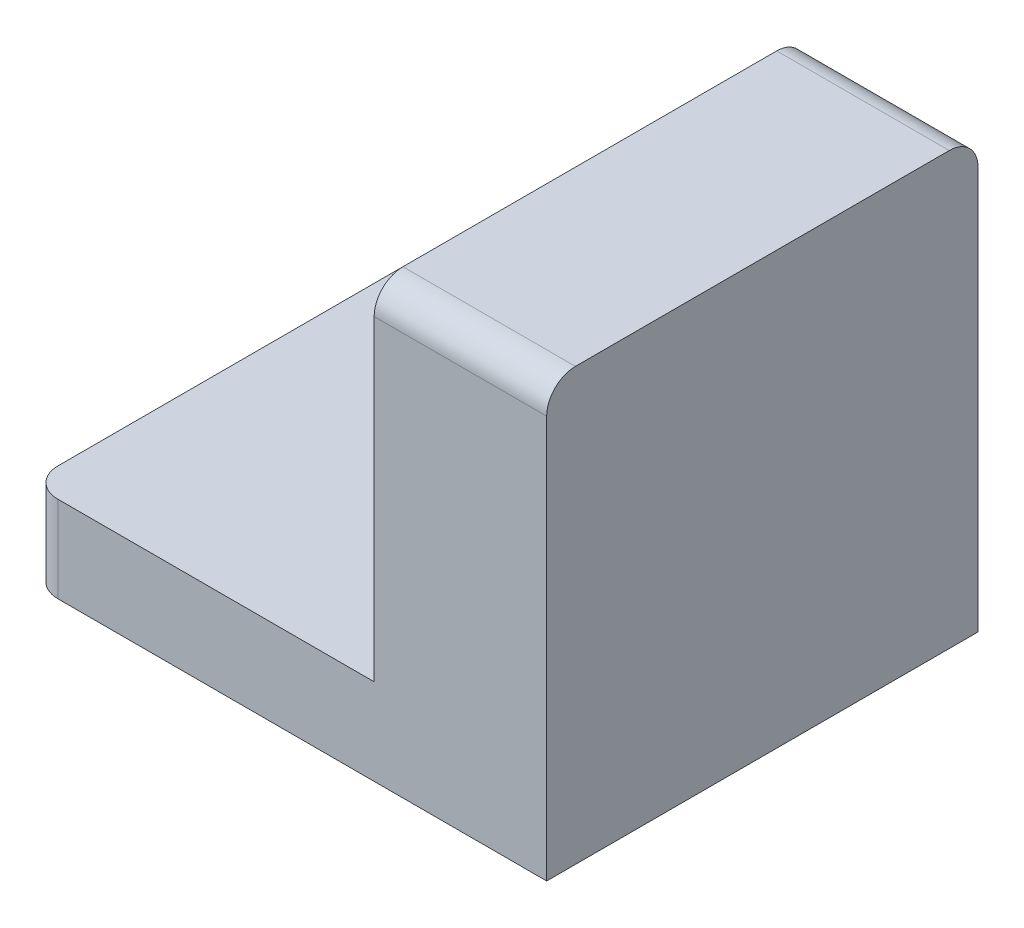
ISO-10303-21;
HEADER;
FILE_DESCRIPTION(('STEP AP214'),'2;1');
FILE_NAME('part.step','',(''),(''),'','','');
FILE_SCHEMA(('AUTOMOTIVE_DESIGN { 1 0 10303 214 1 1 1 1 }'));
ENDSEC;
DATA;
#1=APPLICATION_CONTEXT('core data for automotive mechanical design processes');
#2=APPLICATION_PROTOCOL_DEFINITION('international standard','automotive_design',2000,#1);
#3=PRODUCT_CONTEXT('',#1,'mechanical');
#4=PRODUCT('Part','Part','',(#3));
#5=PRODUCT_RELATED_PRODUCT_CATEGORY('part','',(#4));
#6=PRODUCT_DEFINITION_FORMATION('','',#4);
#7=PRODUCT_DEFINITION_CONTEXT('part definition',#1,'design');
#8=PRODUCT_DEFINITION('design','',#6,#7);
#9=PRODUCT_DEFINITION_SHAPE('','',#8);
#10=(LENGTH_UNIT() NAMED_UNIT(*) SI_UNIT(.MILLI.,.METRE.));
#11=(NAMED_UNIT(*) PLANE_ANGLE_UNIT() SI_UNIT($,.RADIAN.));
#12=(NAMED_UNIT(*) SI_UNIT($,.STERADIAN.) SOLID_ANGLE_UNIT());
#13=UNCERTAINTY_MEASURE_WITH_UNIT(LENGTH_MEASURE(1.E-05),#10,'distance_accuracy_value','');
#14=(GEOMETRIC_REPRESENTATION_CONTEXT(3) GLOBAL_UNCERTAINTY_ASSIGNED_CONTEXT((#13)) GLOBAL_UNIT_ASSIGNED_CONTEXT((#10,
#11,#12)) REPRESENTATION_CONTEXT('',''));
#15=CARTESIAN_POINT('',(0.,0.,0.));
#16=DIRECTION('',(0.,0.,1.));
#17=DIRECTION('',(1.,0.,0.));
#18=AXIS2_PLACEMENT_3D('',#15,#16,#17);
#19=CARTESIAN_POINT('',(-8.,15.,7.5));
#20=DIRECTION('',(1.,0.,0.));
#21=DIRECTION('',(0.,0.,-1.));
#22=AXIS2_PLACEMENT_3D('',#19,#20,#21);
#23=PLANE('',#22);
#24=DIRECTION('',(0.,0.,1.));
#25=VECTOR('',#24,1.);
#26=CARTESIAN_POINT('',(-8.,0.,7.5));
#27=LINE('',#26,#25);
#28=CARTESIAN_POINT('',(-8.,0.,-6.5));
#29=VERTEX_POINT('',#28);
#30=CARTESIAN_POINT('',(-8.,0.,6.5));
#31=VERTEX_POINT('',#30);
#32=EDGE_CURVE('E151',#29,#31,#27,.T.);
#33=ORIENTED_EDGE('',*,*,#32,.T.);
#34=DIRECTION('',(0.,-1.,0.));
#35=VECTOR('',#34,1.);
#36=CARTESIAN_POINT('',(-8.,15.,6.5));
#37=LINE('',#36,#35);
#38=CARTESIAN_POINT('',(-8.,3.,6.5));
#39=VERTEX_POINT('',#38);
#40=EDGE_CURVE('E195',#31,#39,#37,.F.);
#41=ORIENTED_EDGE('',*,*,#40,.T.);
#42=DIRECTION('',(0.,0.,1.));
#43=VECTOR('',#42,1.);
#44=CARTESIAN_POINT('',(-8.,3.,-7.5));
#45=LINE('',#44,#43);
#46=CARTESIAN_POINT('',(-8.,3.,-6.5));
#47=VERTEX_POINT('',#46);
#48=EDGE_CURVE('E131',#47,#39,#45,.T.);
#49=ORIENTED_EDGE('',*,*,#48,.F.);
#50=DIRECTION('',(0.,-1.,0.));
#51=VECTOR('',#50,1.);
#52=CARTESIAN_POINT('',(-8.,15.,-6.5));
#53=LINE('',#52,#51);
#54=EDGE_CURVE('E191',#47,#29,#53,.T.);
#55=ORIENTED_EDGE('',*,*,#54,.T.);
#56=EDGE_LOOP('',(#33,#41,#49,#55));
#57=FACE_BOUND('',#56,.T.);
#58=ADVANCED_FACE('F39',(#57),#23,.F.);
#59=CARTESIAN_POINT('',(10.,15.,7.5));
#60=DIRECTION('',(0.,0.,-1.));
#61=DIRECTION('',(-1.,0.,0.));
#62=AXIS2_PLACEMENT_3D('',#59,#60,#61);
#63=PLANE('',#62);
#64=DIRECTION('',(1.,0.,0.));
#65=VECTOR('',#64,1.);
#66=CARTESIAN_POINT('',(-8.,3.,7.5));
#67=LINE('',#66,#65);
#68=CARTESIAN_POINT('',(-7.,3.,7.5));
#69=VERTEX_POINT('',#68);
#70=CARTESIAN_POINT('',(4.,3.,7.5));
#71=VERTEX_POINT('',#70);
#72=EDGE_CURVE('E117',#69,#71,#67,.T.);
#73=ORIENTED_EDGE('',*,*,#72,.F.);
#74=DIRECTION('',(0.,-1.,0.));
#75=VECTOR('',#74,1.);
#76=CARTESIAN_POINT('',(-7.,15.,7.5));
#77=LINE('',#76,#75);
#78=CARTESIAN_POINT('',(-7.,0.,7.5));
#79=VERTEX_POINT('',#78);
#80=EDGE_CURVE('E182',#69,#79,#77,.T.);
#81=ORIENTED_EDGE('',*,*,#80,.T.);
#82=DIRECTION('',(1.,0.,0.));
#83=VECTOR('',#82,1.);
#84=CARTESIAN_POINT('',(10.,0.,7.5));
#85=LINE('',#84,#83);
#86=CARTESIAN_POINT('',(10.,0.,7.5));
#87=VERTEX_POINT('',#86);
#88=EDGE_CURVE('E164',#79,#87,#85,.T.);
#89=ORIENTED_EDGE('',*,*,#88,.T.);
#90=DIRECTION('',(0.,-1.,0.));
#91=VECTOR('',#90,1.);
#92=CARTESIAN_POINT('',(10.,15.,7.5));
#93=LINE('',#92,#91);
#94=CARTESIAN_POINT('',(10.,14.,7.5));
#95=VERTEX_POINT('',#94);
#96=EDGE_CURVE('E177',#95,#87,#93,.T.);
#97=ORIENTED_EDGE('',*,*,#96,.F.);
#98=DIRECTION('',(1.,0.,0.));
#99=VECTOR('',#98,1.);
#100=CARTESIAN_POINT('',(4.,14.,7.5));
#101=LINE('',#100,#99);
#102=CARTESIAN_POINT('',(4.,14.,7.5));
#103=VERTEX_POINT('',#102);
#104=EDGE_CURVE('E146',#95,#103,#101,.F.);
#105=ORIENTED_EDGE('',*,*,#104,.T.);
#106=DIRECTION('',(0.,1.,0.));
#107=VECTOR('',#106,1.);
#108=CARTESIAN_POINT('',(4.,3.,7.5));
#109=LINE('',#108,#107);
#110=EDGE_CURVE('E137',#71,#103,#109,.T.);
#111=ORIENTED_EDGE('',*,*,#110,.F.);
#112=EDGE_LOOP('',(#73,#81,#89,#97,#105,#111));
#113=FACE_BOUND('',#112,.T.);
#114=ADVANCED_FACE('F144',(#113),#63,.F.);
#115=CARTESIAN_POINT('',(10.,15.,7.5));
#116=DIRECTION('',(-1.,0.,0.));
#117=DIRECTION('',(0.,0.,1.));
#118=AXIS2_PLACEMENT_3D('',#115,#116,#117);
#119=PLANE('',#118);
#120=DIRECTION('',(0.,-1.,0.));
#121=VECTOR('',#120,1.);
#122=CARTESIAN_POINT('',(10.,15.,-7.5));
#123=LINE('',#122,#121);
#124=CARTESIAN_POINT('',(10.,14.,-7.5));
#125=VERTEX_POINT('',#124);
#126=CARTESIAN_POINT('',(10.,0.,-7.5));
#127=VERTEX_POINT('',#126);
#128=EDGE_CURVE('E159',#125,#127,#123,.T.);
#129=ORIENTED_EDGE('',*,*,#128,.F.);
#130=CARTESIAN_POINT('',(10.,14.,-6.5));
#131=DIRECTION('',(-1.,0.,0.));
#132=DIRECTION('',(0.,0.,1.));
#133=AXIS2_PLACEMENT_3D('',#130,#131,#132);
#134=CIRCLE('',#133,1.);
#135=CARTESIAN_POINT('',(10.,15.,-6.5));
#136=VERTEX_POINT('',#135);
#137=EDGE_CURVE('E11',#125,#136,#134,.F.);
#138=ORIENTED_EDGE('',*,*,#137,.T.);
#139=DIRECTION('',(0.,0.,-1.));
#140=VECTOR('',#139,1.);
#141=CARTESIAN_POINT('',(10.,15.,7.5));
#142=LINE('',#141,#140);
#143=CARTESIAN_POINT('',(10.,15.,6.5));
#144=VERTEX_POINT('',#143);
#145=EDGE_CURVE('E156',#144,#136,#142,.T.);
#146=ORIENTED_EDGE('',*,*,#145,.F.);
#147=CARTESIAN_POINT('',(10.,14.,6.5));
#148=DIRECTION('',(-1.,0.,0.));
#149=DIRECTION('',(0.,0.,1.));
#150=AXIS2_PLACEMENT_3D('',#147,#148,#149);
#151=CIRCLE('',#150,1.);
#152=EDGE_CURVE('E48',#144,#95,#151,.F.);
#153=ORIENTED_EDGE('',*,*,#152,.T.);
#154=ORIENTED_EDGE('',*,*,#96,.T.);
#155=DIRECTION('',(0.,0.,-1.));
#156=VECTOR('',#155,1.);
#157=CARTESIAN_POINT('',(10.,0.,7.5));
#158=LINE('',#157,#156);
#159=EDGE_CURVE('E168',#87,#127,#158,.T.);
#160=ORIENTED_EDGE('',*,*,#159,.T.);
#161=EDGE_LOOP('',(#129,#138,#146,#153,#154,#160));
#162=FACE_BOUND('',#161,.T.);
#163=ADVANCED_FACE('F222',(#162),#119,.F.);
#164=CARTESIAN_POINT('',(10.,15.,-7.5));
#165=DIRECTION('',(0.,0.,1.));
#166=DIRECTION('',(1.,0.,0.));
#167=AXIS2_PLACEMENT_3D('',#164,#165,#166);
#168=PLANE('',#167);
#169=DIRECTION('',(-1.,0.,0.));
#170=VECTOR('',#169,1.);
#171=CARTESIAN_POINT('',(10.,0.,-7.5));
#172=LINE('',#171,#170);
#173=CARTESIAN_POINT('',(-7.,0.,-7.5));
#174=VERTEX_POINT('',#173);
#175=EDGE_CURVE('E160',#127,#174,#172,.T.);
#176=ORIENTED_EDGE('',*,*,#175,.T.);
#177=DIRECTION('',(0.,-1.,0.));
#178=VECTOR('',#177,1.);
#179=CARTESIAN_POINT('',(-7.,15.,-7.5));
#180=LINE('',#179,#178);
#181=CARTESIAN_POINT('',(-7.,3.,-7.5));
#182=VERTEX_POINT('',#181);
#183=EDGE_CURVE('E206',#174,#182,#180,.F.);
#184=ORIENTED_EDGE('',*,*,#183,.T.);
#185=DIRECTION('',(-1.,0.,0.));
#186=VECTOR('',#185,1.);
#187=CARTESIAN_POINT('',(-8.,3.,-7.5));
#188=LINE('',#187,#186);
#189=CARTESIAN_POINT('',(4.,3.,-7.5));
#190=VERTEX_POINT('',#189);
#191=EDGE_CURVE('E142',#190,#182,#188,.T.);
#192=ORIENTED_EDGE('',*,*,#191,.F.);
#193=DIRECTION('',(0.,1.,0.));
#194=VECTOR('',#193,1.);
#195=CARTESIAN_POINT('',(4.,3.,-7.5));
#196=LINE('',#195,#194);
#197=CARTESIAN_POINT('',(4.,14.,-7.5));
#198=VERTEX_POINT('',#197);
#199=EDGE_CURVE('E140',#190,#198,#196,.T.);
#200=ORIENTED_EDGE('',*,*,#199,.T.);
#201=DIRECTION('',(-1.,0.,0.));
#202=VECTOR('',#201,1.);
#203=CARTESIAN_POINT('',(10.,14.,-7.5));
#204=LINE('',#203,#202);
#205=EDGE_CURVE('E203',#198,#125,#204,.F.);
#206=ORIENTED_EDGE('',*,*,#205,.T.);
#207=ORIENTED_EDGE('',*,*,#128,.T.);
#208=EDGE_LOOP('',(#176,#184,#192,#200,#206,#207));
#209=FACE_BOUND('',#208,.T.);
#210=ADVANCED_FACE('F288',(#209),#168,.F.);
#211=CARTESIAN_POINT('',(0.,15.,0.));
#212=DIRECTION('',(0.,1.,0.));
#213=DIRECTION('',(0.,0.,1.));
#214=AXIS2_PLACEMENT_3D('',#211,#212,#213);
#215=PLANE('',#214);
#216=ORIENTED_EDGE('',*,*,#145,.T.);
#217=DIRECTION('',(-1.,0.,0.));
#218=VECTOR('',#217,1.);
#219=CARTESIAN_POINT('',(4.,15.,-6.5));
#220=LINE('',#219,#218);
#221=CARTESIAN_POINT('',(4.,15.,-6.5));
#222=VERTEX_POINT('',#221);
#223=EDGE_CURVE('E212',#136,#222,#220,.T.);
#224=ORIENTED_EDGE('',*,*,#223,.T.);
#225=DIRECTION('',(0.,0.,-1.));
#226=VECTOR('',#225,1.);
#227=CARTESIAN_POINT('',(4.,15.,-7.5));
#228=LINE('',#227,#226);
#229=CARTESIAN_POINT('',(4.,15.,6.5));
#230=VERTEX_POINT('',#229);
#231=EDGE_CURVE('E226',#230,#222,#228,.T.);
#232=ORIENTED_EDGE('',*,*,#231,.F.);
#233=DIRECTION('',(1.,0.,0.));
#234=VECTOR('',#233,1.);
#235=CARTESIAN_POINT('',(10.,15.,6.5));
#236=LINE('',#235,#234);
#237=EDGE_CURVE('E209',#230,#144,#236,.T.);
#238=ORIENTED_EDGE('',*,*,#237,.T.);
#239=EDGE_LOOP('',(#216,#224,#232,#238));
#240=FACE_BOUND('',#239,.T.);
#241=ADVANCED_FACE('F228',(#240),#215,.T.);
#242=CARTESIAN_POINT('',(0.,0.,0.));
#243=DIRECTION('',(0.,1.,0.));
#244=DIRECTION('',(0.,0.,1.));
#245=AXIS2_PLACEMENT_3D('',#242,#243,#244);
#246=PLANE('',#245);
#247=CARTESIAN_POINT('',(0.,0.,0.));
#248=DIRECTION('',(0.,1.,0.));
#249=DIRECTION('',(0.,0.,1.));
#250=AXIS2_PLACEMENT_3D('',#247,#248,#249);
#251=CIRCLE('',#250,2.125);
#252=CARTESIAN_POINT('',(0.,0.,2.125));
#253=VERTEX_POINT('',#252);
#254=EDGE_CURVE('E241',#253,#253,#251,.T.);
#255=ORIENTED_EDGE('',*,*,#254,.T.);
#256=EDGE_LOOP('',(#255));
#257=FACE_BOUND('',#256,.T.);
#258=ORIENTED_EDGE('',*,*,#88,.F.);
#259=CARTESIAN_POINT('',(-7.,0.,6.5));
#260=DIRECTION('',(0.,1.,0.));
#261=DIRECTION('',(0.,0.,1.));
#262=AXIS2_PLACEMENT_3D('',#259,#260,#261);
#263=CIRCLE('',#262,1.);
#264=EDGE_CURVE('E188',#79,#31,#263,.F.);
#265=ORIENTED_EDGE('',*,*,#264,.T.);
#266=ORIENTED_EDGE('',*,*,#32,.F.);
#267=CARTESIAN_POINT('',(-7.,0.,-6.5));
#268=DIRECTION('',(0.,1.,0.));
#269=DIRECTION('',(0.,0.,1.));
#270=AXIS2_PLACEMENT_3D('',#267,#268,#269);
#271=CIRCLE('',#270,1.);
#272=EDGE_CURVE('E185',#29,#174,#271,.F.);
#273=ORIENTED_EDGE('',*,*,#272,.T.);
#274=ORIENTED_EDGE('',*,*,#175,.F.);
#275=ORIENTED_EDGE('',*,*,#159,.F.);
#276=EDGE_LOOP('',(#258,#265,#266,#273,#274,#275));
#277=FACE_BOUND('',#276,.T.);
#278=ADVANCED_FACE('F264',(#257,#277),#246,.F.);
#279=CARTESIAN_POINT('',(4.,3.,-7.5));
#280=DIRECTION('',(1.,0.,0.));
#281=DIRECTION('',(0.,0.,-1.));
#282=AXIS2_PLACEMENT_3D('',#279,#280,#281);
#283=PLANE('',#282);
#284=CARTESIAN_POINT('',(4.,9.,0.));
#285=DIRECTION('',(-1.,0.,0.));
#286=DIRECTION('',(0.,0.,1.));
#287=AXIS2_PLACEMENT_3D('',#284,#285,#286);
#288=CIRCLE('',#287,5.125);
#289=CARTESIAN_POINT('',(4.,9.,5.125));
#290=VERTEX_POINT('',#289);
#291=EDGE_CURVE('E236',#290,#290,#288,.T.);
#292=ORIENTED_EDGE('',*,*,#291,.F.);
#293=EDGE_LOOP('',(#292));
#294=FACE_BOUND('',#293,.T.);
#295=ORIENTED_EDGE('',*,*,#231,.T.);
#296=CARTESIAN_POINT('',(4.,14.,-6.5));
#297=DIRECTION('',(1.,0.,0.));
#298=DIRECTION('',(0.,0.,-1.));
#299=AXIS2_PLACEMENT_3D('',#296,#297,#298);
#300=CIRCLE('',#299,1.);
#301=EDGE_CURVE('E219',#222,#198,#300,.F.);
#302=ORIENTED_EDGE('',*,*,#301,.T.);
#303=ORIENTED_EDGE('',*,*,#199,.F.);
#304=DIRECTION('',(0.,0.,-1.));
#305=VECTOR('',#304,1.);
#306=CARTESIAN_POINT('',(4.,3.,-7.5));
#307=LINE('',#306,#305);
#308=EDGE_CURVE('E122',#71,#190,#307,.T.);
#309=ORIENTED_EDGE('',*,*,#308,.F.);
#310=ORIENTED_EDGE('',*,*,#110,.T.);
#311=CARTESIAN_POINT('',(4.,14.,6.5));
#312=DIRECTION('',(1.,0.,0.));
#313=DIRECTION('',(0.,0.,-1.));
#314=AXIS2_PLACEMENT_3D('',#311,#312,#313);
#315=CIRCLE('',#314,1.);
#316=EDGE_CURVE('E216',#103,#230,#315,.F.);
#317=ORIENTED_EDGE('',*,*,#316,.T.);
#318=EDGE_LOOP('',(#295,#302,#303,#309,#310,#317));
#319=FACE_BOUND('',#318,.T.);
#320=ADVANCED_FACE('F136',(#294,#319),#283,.F.);
#321=CARTESIAN_POINT('',(0.,3.,0.));
#322=DIRECTION('',(0.,1.,0.));
#323=DIRECTION('',(0.,0.,1.));
#324=AXIS2_PLACEMENT_3D('',#321,#322,#323);
#325=PLANE('',#324);
#326=CARTESIAN_POINT('',(0.,3.,0.));
#327=DIRECTION('',(0.,1.,0.));
#328=DIRECTION('',(0.,0.,1.));
#329=AXIS2_PLACEMENT_3D('',#326,#327,#328);
#330=CIRCLE('',#329,2.125);
#331=CARTESIAN_POINT('',(0.,3.,2.125));
#332=VERTEX_POINT('',#331);
#333=EDGE_CURVE('E246',#332,#332,#330,.T.);
#334=ORIENTED_EDGE('',*,*,#333,.F.);
#335=EDGE_LOOP('',(#334));
#336=FACE_BOUND('',#335,.T.);
#337=ORIENTED_EDGE('',*,*,#48,.T.);
#338=CARTESIAN_POINT('',(-7.,3.,6.5));
#339=DIRECTION('',(0.,1.,0.));
#340=DIRECTION('',(0.,0.,1.));
#341=AXIS2_PLACEMENT_3D('',#338,#339,#340);
#342=CIRCLE('',#341,1.);
#343=EDGE_CURVE('E125',#39,#69,#342,.T.);
#344=ORIENTED_EDGE('',*,*,#343,.T.);
#345=ORIENTED_EDGE('',*,*,#72,.T.);
#346=ORIENTED_EDGE('',*,*,#308,.T.);
#347=ORIENTED_EDGE('',*,*,#191,.T.);
#348=CARTESIAN_POINT('',(-7.,3.,-6.5));
#349=DIRECTION('',(0.,1.,0.));
#350=DIRECTION('',(0.,0.,1.));
#351=AXIS2_PLACEMENT_3D('',#348,#349,#350);
#352=CIRCLE('',#351,1.);
#353=EDGE_CURVE('E198',#182,#47,#352,.T.);
#354=ORIENTED_EDGE('',*,*,#353,.T.);
#355=EDGE_LOOP('',(#337,#344,#345,#346,#347,#354));
#356=FACE_BOUND('',#355,.T.);
#357=ADVANCED_FACE('F120',(#336,#356),#325,.T.);
#358=CARTESIAN_POINT('',(-7.,15.,6.5));
#359=DIRECTION('',(0.,-1.,0.));
#360=DIRECTION('',(0.,0.,-1.));
#361=AXIS2_PLACEMENT_3D('',#358,#359,#360);
#362=CYLINDRICAL_SURFACE('',#361,1.);
#363=ORIENTED_EDGE('',*,*,#343,.F.);
#364=ORIENTED_EDGE('',*,*,#40,.F.);
#365=ORIENTED_EDGE('',*,*,#264,.F.);
#366=ORIENTED_EDGE('',*,*,#80,.F.);
#367=EDGE_LOOP('',(#363,#364,#365,#366));
#368=FACE_BOUND('',#367,.T.);
#369=ADVANCED_FACE('F255',(#368),#362,.T.);
#370=CARTESIAN_POINT('',(-7.,15.,-6.5));
#371=DIRECTION('',(0.,-1.,0.));
#372=DIRECTION('',(0.,0.,-1.));
#373=AXIS2_PLACEMENT_3D('',#370,#371,#372);
#374=CYLINDRICAL_SURFACE('',#373,1.);
#375=ORIENTED_EDGE('',*,*,#353,.F.);
#376=ORIENTED_EDGE('',*,*,#183,.F.);
#377=ORIENTED_EDGE('',*,*,#272,.F.);
#378=ORIENTED_EDGE('',*,*,#54,.F.);
#379=EDGE_LOOP('',(#375,#376,#377,#378));
#380=FACE_BOUND('',#379,.T.);
#381=ADVANCED_FACE('F261',(#380),#374,.T.);
#382=CARTESIAN_POINT('',(0.,14.,-6.5));
#383=DIRECTION('',(1.,0.,0.));
#384=DIRECTION('',(0.,0.,-1.));
#385=AXIS2_PLACEMENT_3D('',#382,#383,#384);
#386=CYLINDRICAL_SURFACE('',#385,1.);
#387=ORIENTED_EDGE('',*,*,#137,.F.);
#388=ORIENTED_EDGE('',*,*,#205,.F.);
#389=ORIENTED_EDGE('',*,*,#301,.F.);
#390=ORIENTED_EDGE('',*,*,#223,.F.);
#391=EDGE_LOOP('',(#387,#388,#389,#390));
#392=FACE_BOUND('',#391,.T.);
#393=ADVANCED_FACE('F278',(#392),#386,.T.);
#394=CARTESIAN_POINT('',(0.,14.,6.5));
#395=DIRECTION('',(-1.,0.,0.));
#396=DIRECTION('',(0.,0.,1.));
#397=AXIS2_PLACEMENT_3D('',#394,#395,#396);
#398=CYLINDRICAL_SURFACE('',#397,1.);
#399=ORIENTED_EDGE('',*,*,#316,.F.);
#400=ORIENTED_EDGE('',*,*,#104,.F.);
#401=ORIENTED_EDGE('',*,*,#152,.F.);
#402=ORIENTED_EDGE('',*,*,#237,.F.);
#403=EDGE_LOOP('',(#399,#400,#401,#402));
#404=FACE_BOUND('',#403,.T.);
#405=ADVANCED_FACE('F41',(#404),#398,.T.);
#406=CARTESIAN_POINT('',(9.5,9.,0.));
#407=DIRECTION('',(-1.,0.,0.));
#408=DIRECTION('',(0.,0.,1.));
#409=AXIS2_PLACEMENT_3D('',#406,#407,#408);
#410=CYLINDRICAL_SURFACE('',#409,5.125);
#411=CARTESIAN_POINT('',(9.5,9.,0.));
#412=DIRECTION('',(-1.,0.,0.));
#413=DIRECTION('',(0.,0.,1.));
#414=AXIS2_PLACEMENT_3D('',#411,#412,#413);
#415=CIRCLE('',#414,5.125);
#416=CARTESIAN_POINT('',(9.5,9.,5.125));
#417=VERTEX_POINT('',#416);
#418=EDGE_CURVE('E231',#417,#417,#415,.T.);
#419=ORIENTED_EDGE('',*,*,#418,.F.);
#420=EDGE_LOOP('',(#419));
#421=FACE_BOUND('',#420,.T.);
#422=ORIENTED_EDGE('',*,*,#291,.T.);
#423=EDGE_LOOP('',(#422));
#424=FACE_BOUND('',#423,.T.);
#425=ADVANCED_FACE('F285',(#421,#424),#410,.F.);
#426=CARTESIAN_POINT('',(9.5,9.,0.));
#427=DIRECTION('',(-1.,0.,0.));
#428=DIRECTION('',(0.,0.,1.));
#429=AXIS2_PLACEMENT_3D('',#426,#427,#428);
#430=PLANE('',#429);
#431=ORIENTED_EDGE('',*,*,#418,.T.);
#432=EDGE_LOOP('',(#431));
#433=FACE_BOUND('',#432,.T.);
#434=ADVANCED_FACE('F359',(#433),#430,.T.);
#435=CARTESIAN_POINT('',(0.,-2.5,0.));
#436=DIRECTION('',(0.,1.,0.));
#437=DIRECTION('',(0.,0.,1.));
#438=AXIS2_PLACEMENT_3D('',#435,#436,#437);
#439=CYLINDRICAL_SURFACE('',#438,2.125);
#440=ORIENTED_EDGE('',*,*,#333,.T.);
#441=EDGE_LOOP('',(#440));
#442=FACE_BOUND('',#441,.T.);
#443=ORIENTED_EDGE('',*,*,#254,.F.);
#444=EDGE_LOOP('',(#443));
#445=FACE_BOUND('',#444,.T.);
#446=ADVANCED_FACE('F251',(#442,#445),#439,.F.);
#447=CLOSED_SHELL('',(#58,#114,#163,#210,#241,#278,#320,#357,#369,#381,#393,#405,#425,#434,#446));
#448=MANIFOLD_SOLID_BREP('B2',#447);
#449=ADVANCED_BREP_SHAPE_REPRESENTATION('',(#18,#448),#14);
#450=SHAPE_DEFINITION_REPRESENTATION(#9,#449);
ENDSEC;
END-ISO-10303-21;
